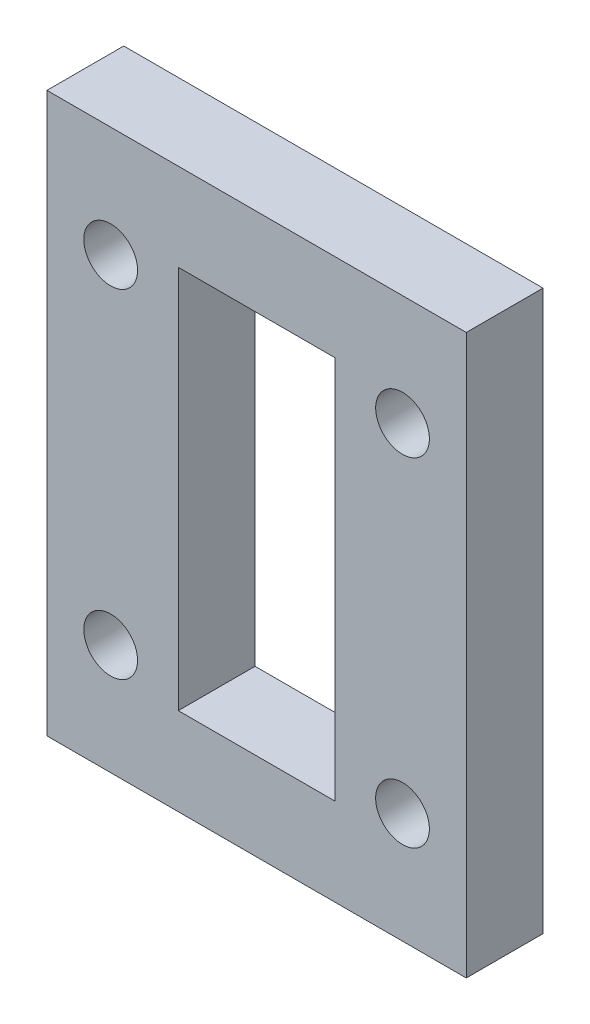
ISO-10303-21;
HEADER;
FILE_DESCRIPTION(('STEP AP214'),'2;1');
FILE_NAME('part.step','',(''),(''),'','','');
FILE_SCHEMA(('AUTOMOTIVE_DESIGN { 1 0 10303 214 1 1 1 1 }'));
ENDSEC;
DATA;
#1=APPLICATION_CONTEXT('core data for automotive mechanical design processes');
#2=APPLICATION_PROTOCOL_DEFINITION('international standard','automotive_design',2000,#1);
#3=PRODUCT_CONTEXT('',#1,'mechanical');
#4=PRODUCT('Part','Part','',(#3));
#5=PRODUCT_RELATED_PRODUCT_CATEGORY('part','',(#4));
#6=PRODUCT_DEFINITION_FORMATION('','',#4);
#7=PRODUCT_DEFINITION_CONTEXT('part definition',#1,'design');
#8=PRODUCT_DEFINITION('design','',#6,#7);
#9=PRODUCT_DEFINITION_SHAPE('','',#8);
#10=(LENGTH_UNIT() NAMED_UNIT(*) SI_UNIT(.MILLI.,.METRE.));
#11=(NAMED_UNIT(*) PLANE_ANGLE_UNIT() SI_UNIT($,.RADIAN.));
#12=(NAMED_UNIT(*) SI_UNIT($,.STERADIAN.) SOLID_ANGLE_UNIT());
#13=UNCERTAINTY_MEASURE_WITH_UNIT(LENGTH_MEASURE(1.E-05),#10,'distance_accuracy_value','');
#14=(GEOMETRIC_REPRESENTATION_CONTEXT(3) GLOBAL_UNCERTAINTY_ASSIGNED_CONTEXT((#13)) GLOBAL_UNIT_ASSIGNED_CONTEXT((#10,
#11,#12)) REPRESENTATION_CONTEXT('',''));
#15=CARTESIAN_POINT('',(0.,0.,0.));
#16=DIRECTION('',(0.,0.,1.));
#17=DIRECTION('',(1.,0.,0.));
#18=AXIS2_PLACEMENT_3D('',#15,#16,#17);
#19=CARTESIAN_POINT('',(0.,0.,5.));
#20=DIRECTION('',(0.,0.,-1.));
#21=DIRECTION('',(-1.,0.,0.));
#22=AXIS2_PLACEMENT_3D('',#19,#20,#21);
#23=PLANE('',#22);
#24=CARTESIAN_POINT('',(9.5,11.,5.));
#25=DIRECTION('',(0.,0.,1.));
#26=DIRECTION('',(-1.,0.,0.));
#27=AXIS2_PLACEMENT_3D('',#24,#25,#26);
#28=CIRCLE('',#27,1.75);
#29=CARTESIAN_POINT('',(7.75,11.,5.));
#30=VERTEX_POINT('',#29);
#31=EDGE_CURVE('E250',#30,#30,#28,.T.);
#32=ORIENTED_EDGE('',*,*,#31,.F.);
#33=EDGE_LOOP('',(#32));
#34=FACE_BOUND('',#33,.T.);
#35=CARTESIAN_POINT('',(-9.5,-11.,5.));
#36=DIRECTION('',(0.,0.,1.));
#37=DIRECTION('',(-1.,0.,0.));
#38=AXIS2_PLACEMENT_3D('',#35,#36,#37);
#39=CIRCLE('',#38,1.75);
#40=CARTESIAN_POINT('',(-11.25,-11.,5.));
#41=VERTEX_POINT('',#40);
#42=EDGE_CURVE('E243',#41,#41,#39,.T.);
#43=ORIENTED_EDGE('',*,*,#42,.F.);
#44=EDGE_LOOP('',(#43));
#45=FACE_BOUND('',#44,.T.);
#46=CARTESIAN_POINT('',(9.5,-11.,5.));
#47=DIRECTION('',(0.,0.,1.));
#48=DIRECTION('',(1.,0.,0.));
#49=AXIS2_PLACEMENT_3D('',#46,#47,#48);
#50=CIRCLE('',#49,1.75);
#51=CARTESIAN_POINT('',(11.25,-11.,5.));
#52=VERTEX_POINT('',#51);
#53=EDGE_CURVE('E238',#52,#52,#50,.T.);
#54=ORIENTED_EDGE('',*,*,#53,.F.);
#55=EDGE_LOOP('',(#54));
#56=FACE_BOUND('',#55,.T.);
#57=CARTESIAN_POINT('',(-9.5,11.,5.));
#58=DIRECTION('',(0.,0.,1.));
#59=DIRECTION('',(1.,0.,0.));
#60=AXIS2_PLACEMENT_3D('',#57,#58,#59);
#61=CIRCLE('',#60,1.75);
#62=CARTESIAN_POINT('',(-7.75,11.,5.));
#63=VERTEX_POINT('',#62);
#64=EDGE_CURVE('E255',#63,#63,#61,.T.);
#65=ORIENTED_EDGE('',*,*,#64,.F.);
#66=EDGE_LOOP('',(#65));
#67=FACE_BOUND('',#66,.T.);
#68=DIRECTION('',(0.,1.,0.));
#69=VECTOR('',#68,1.);
#70=CARTESIAN_POINT('',(13.65,-18.2,5.));
#71=LINE('',#70,#69);
#72=CARTESIAN_POINT('',(13.65,-18.2,5.));
#73=VERTEX_POINT('',#72);
#74=CARTESIAN_POINT('',(13.65,18.2,5.));
#75=VERTEX_POINT('',#74);
#76=EDGE_CURVE('E138',#73,#75,#71,.T.);
#77=ORIENTED_EDGE('',*,*,#76,.T.);
#78=DIRECTION('',(-1.,0.,0.));
#79=VECTOR('',#78,1.);
#80=CARTESIAN_POINT('',(-13.65,18.2,5.));
#81=LINE('',#80,#79);
#82=CARTESIAN_POINT('',(-13.65,18.2,5.));
#83=VERTEX_POINT('',#82);
#84=EDGE_CURVE('E141',#75,#83,#81,.T.);
#85=ORIENTED_EDGE('',*,*,#84,.T.);
#86=DIRECTION('',(0.,-1.,0.));
#87=VECTOR('',#86,1.);
#88=CARTESIAN_POINT('',(-13.65,-18.2,5.));
#89=LINE('',#88,#87);
#90=CARTESIAN_POINT('',(-13.65,-18.2,5.));
#91=VERTEX_POINT('',#90);
#92=EDGE_CURVE('E144',#83,#91,#89,.T.);
#93=ORIENTED_EDGE('',*,*,#92,.T.);
#94=DIRECTION('',(1.,0.,0.));
#95=VECTOR('',#94,1.);
#96=CARTESIAN_POINT('',(-13.65,-18.2,5.));
#97=LINE('',#96,#95);
#98=EDGE_CURVE('E146',#91,#73,#97,.T.);
#99=ORIENTED_EDGE('',*,*,#98,.T.);
#100=EDGE_LOOP('',(#77,#85,#93,#99));
#101=FACE_BOUND('',#100,.T.);
#102=DIRECTION('',(0.,1.,0.));
#103=VECTOR('',#102,1.);
#104=CARTESIAN_POINT('',(5.09999999999999,-12.5,5.));
#105=LINE('',#104,#103);
#106=CARTESIAN_POINT('',(5.09999999999999,-12.5,5.));
#107=VERTEX_POINT('',#106);
#108=CARTESIAN_POINT('',(5.09999999999999,12.5,5.));
#109=VERTEX_POINT('',#108);
#110=EDGE_CURVE('E100',#107,#109,#105,.T.);
#111=ORIENTED_EDGE('',*,*,#110,.F.);
#112=DIRECTION('',(1.,0.,0.));
#113=VECTOR('',#112,1.);
#114=CARTESIAN_POINT('',(-5.10000000000001,-12.5,5.));
#115=LINE('',#114,#113);
#116=CARTESIAN_POINT('',(-5.10000000000001,-12.5,5.));
#117=VERTEX_POINT('',#116);
#118=EDGE_CURVE('E122',#117,#107,#115,.T.);
#119=ORIENTED_EDGE('',*,*,#118,.F.);
#120=DIRECTION('',(0.,-1.,0.));
#121=VECTOR('',#120,1.);
#122=CARTESIAN_POINT('',(-5.10000000000001,-12.5,5.));
#123=LINE('',#122,#121);
#124=CARTESIAN_POINT('',(-5.10000000000001,12.5,5.));
#125=VERTEX_POINT('',#124);
#126=EDGE_CURVE('E120',#125,#117,#123,.T.);
#127=ORIENTED_EDGE('',*,*,#126,.F.);
#128=DIRECTION('',(-1.,0.,0.));
#129=VECTOR('',#128,1.);
#130=CARTESIAN_POINT('',(-5.10000000000001,12.5,5.));
#131=LINE('',#130,#129);
#132=EDGE_CURVE('E108',#109,#125,#131,.T.);
#133=ORIENTED_EDGE('',*,*,#132,.F.);
#134=EDGE_LOOP('',(#111,#119,#127,#133));
#135=FACE_BOUND('',#134,.T.);
#136=ADVANCED_FACE('F35',(#34,#45,#56,#67,#101,#135),#23,.F.);
#137=CARTESIAN_POINT('',(0.,0.,0.));
#138=DIRECTION('',(0.,0.,-1.));
#139=DIRECTION('',(-1.,0.,0.));
#140=AXIS2_PLACEMENT_3D('',#137,#138,#139);
#141=PLANE('',#140);
#142=CARTESIAN_POINT('',(9.5,11.,0.));
#143=DIRECTION('',(0.,0.,-1.));
#144=DIRECTION('',(-1.,0.,0.));
#145=AXIS2_PLACEMENT_3D('',#142,#143,#144);
#146=CIRCLE('',#145,1.75);
#147=CARTESIAN_POINT('',(7.75,11.,0.));
#148=VERTEX_POINT('',#147);
#149=EDGE_CURVE('E253',#148,#148,#146,.F.);
#150=ORIENTED_EDGE('',*,*,#149,.T.);
#151=EDGE_LOOP('',(#150));
#152=FACE_BOUND('',#151,.T.);
#153=CARTESIAN_POINT('',(-9.5,-11.,0.));
#154=DIRECTION('',(0.,0.,-1.));
#155=DIRECTION('',(-1.,0.,0.));
#156=AXIS2_PLACEMENT_3D('',#153,#154,#155);
#157=CIRCLE('',#156,1.75);
#158=CARTESIAN_POINT('',(-11.25,-11.,0.));
#159=VERTEX_POINT('',#158);
#160=EDGE_CURVE('E246',#159,#159,#157,.F.);
#161=ORIENTED_EDGE('',*,*,#160,.T.);
#162=EDGE_LOOP('',(#161));
#163=FACE_BOUND('',#162,.T.);
#164=CARTESIAN_POINT('',(9.5,-11.,0.));
#165=DIRECTION('',(0.,0.,-1.));
#166=DIRECTION('',(-1.,0.,0.));
#167=AXIS2_PLACEMENT_3D('',#164,#165,#166);
#168=CIRCLE('',#167,1.75);
#169=CARTESIAN_POINT('',(7.75,-11.,0.));
#170=VERTEX_POINT('',#169);
#171=EDGE_CURVE('E241',#170,#170,#168,.F.);
#172=ORIENTED_EDGE('',*,*,#171,.T.);
#173=EDGE_LOOP('',(#172));
#174=FACE_BOUND('',#173,.T.);
#175=CARTESIAN_POINT('',(-9.5,11.,0.));
#176=DIRECTION('',(0.,0.,-1.));
#177=DIRECTION('',(-1.,0.,0.));
#178=AXIS2_PLACEMENT_3D('',#175,#176,#177);
#179=CIRCLE('',#178,1.75);
#180=CARTESIAN_POINT('',(-11.25,11.,0.));
#181=VERTEX_POINT('',#180);
#182=EDGE_CURVE('E128',#181,#181,#179,.F.);
#183=ORIENTED_EDGE('',*,*,#182,.T.);
#184=EDGE_LOOP('',(#183));
#185=FACE_BOUND('',#184,.T.);
#186=DIRECTION('',(0.,1.,0.));
#187=VECTOR('',#186,1.);
#188=CARTESIAN_POINT('',(13.65,-18.2,0.));
#189=LINE('',#188,#187);
#190=CARTESIAN_POINT('',(13.65,-18.2,0.));
#191=VERTEX_POINT('',#190);
#192=CARTESIAN_POINT('',(13.65,18.2,0.));
#193=VERTEX_POINT('',#192);
#194=EDGE_CURVE('E116',#191,#193,#189,.T.);
#195=ORIENTED_EDGE('',*,*,#194,.F.);
#196=DIRECTION('',(1.,0.,0.));
#197=VECTOR('',#196,1.);
#198=CARTESIAN_POINT('',(-13.65,-18.2,0.));
#199=LINE('',#198,#197);
#200=CARTESIAN_POINT('',(-13.65,-18.2,0.));
#201=VERTEX_POINT('',#200);
#202=EDGE_CURVE('E142',#201,#191,#199,.T.);
#203=ORIENTED_EDGE('',*,*,#202,.F.);
#204=DIRECTION('',(0.,-1.,0.));
#205=VECTOR('',#204,1.);
#206=CARTESIAN_POINT('',(-13.65,-18.2,0.));
#207=LINE('',#206,#205);
#208=CARTESIAN_POINT('',(-13.65,18.2,0.));
#209=VERTEX_POINT('',#208);
#210=EDGE_CURVE('E153',#209,#201,#207,.T.);
#211=ORIENTED_EDGE('',*,*,#210,.F.);
#212=DIRECTION('',(-1.,0.,0.));
#213=VECTOR('',#212,1.);
#214=CARTESIAN_POINT('',(-13.65,18.2,0.));
#215=LINE('',#214,#213);
#216=EDGE_CURVE('E151',#193,#209,#215,.T.);
#217=ORIENTED_EDGE('',*,*,#216,.F.);
#218=EDGE_LOOP('',(#195,#203,#211,#217));
#219=FACE_BOUND('',#218,.T.);
#220=DIRECTION('',(1.,0.,0.));
#221=VECTOR('',#220,1.);
#222=CARTESIAN_POINT('',(-5.10000000000001,-12.5,0.));
#223=LINE('',#222,#221);
#224=CARTESIAN_POINT('',(-5.10000000000001,-12.5,0.));
#225=VERTEX_POINT('',#224);
#226=CARTESIAN_POINT('',(5.09999999999999,-12.5,0.));
#227=VERTEX_POINT('',#226);
#228=EDGE_CURVE('E109',#225,#227,#223,.T.);
#229=ORIENTED_EDGE('',*,*,#228,.T.);
#230=DIRECTION('',(0.,1.,0.));
#231=VECTOR('',#230,1.);
#232=CARTESIAN_POINT('',(5.09999999999999,-12.5,0.));
#233=LINE('',#232,#231);
#234=CARTESIAN_POINT('',(5.09999999999999,12.5,0.));
#235=VERTEX_POINT('',#234);
#236=EDGE_CURVE('E58',#227,#235,#233,.T.);
#237=ORIENTED_EDGE('',*,*,#236,.T.);
#238=DIRECTION('',(-1.,0.,0.));
#239=VECTOR('',#238,1.);
#240=CARTESIAN_POINT('',(-5.10000000000001,12.5,0.));
#241=LINE('',#240,#239);
#242=CARTESIAN_POINT('',(-5.10000000000001,12.5,0.));
#243=VERTEX_POINT('',#242);
#244=EDGE_CURVE('E115',#235,#243,#241,.T.);
#245=ORIENTED_EDGE('',*,*,#244,.T.);
#246=DIRECTION('',(0.,-1.,0.));
#247=VECTOR('',#246,1.);
#248=CARTESIAN_POINT('',(-5.10000000000001,-12.5,0.));
#249=LINE('',#248,#247);
#250=EDGE_CURVE('E130',#243,#225,#249,.T.);
#251=ORIENTED_EDGE('',*,*,#250,.T.);
#252=EDGE_LOOP('',(#229,#237,#245,#251));
#253=FACE_BOUND('',#252,.T.);
#254=ADVANCED_FACE('F171',(#152,#163,#174,#185,#219,#253),#141,.T.);
#255=CARTESIAN_POINT('',(13.65,-18.2,5.));
#256=DIRECTION('',(-1.,0.,0.));
#257=DIRECTION('',(0.,0.,1.));
#258=AXIS2_PLACEMENT_3D('',#255,#256,#257);
#259=PLANE('',#258);
#260=ORIENTED_EDGE('',*,*,#194,.T.);
#261=DIRECTION('',(0.,0.,-1.));
#262=VECTOR('',#261,1.);
#263=CARTESIAN_POINT('',(13.65,18.2,5.));
#264=LINE('',#263,#262);
#265=EDGE_CURVE('E11',#75,#193,#264,.T.);
#266=ORIENTED_EDGE('',*,*,#265,.F.);
#267=ORIENTED_EDGE('',*,*,#76,.F.);
#268=DIRECTION('',(0.,0.,-1.));
#269=VECTOR('',#268,1.);
#270=CARTESIAN_POINT('',(13.65,-18.2,5.));
#271=LINE('',#270,#269);
#272=EDGE_CURVE('E148',#73,#191,#271,.T.);
#273=ORIENTED_EDGE('',*,*,#272,.T.);
#274=EDGE_LOOP('',(#260,#266,#267,#273));
#275=FACE_BOUND('',#274,.T.);
#276=ADVANCED_FACE('F37',(#275),#259,.F.);
#277=CARTESIAN_POINT('',(-13.65,18.2,5.));
#278=DIRECTION('',(0.,-1.,0.));
#279=DIRECTION('',(0.,0.,-1.));
#280=AXIS2_PLACEMENT_3D('',#277,#278,#279);
#281=PLANE('',#280);
#282=ORIENTED_EDGE('',*,*,#216,.T.);
#283=DIRECTION('',(0.,0.,-1.));
#284=VECTOR('',#283,1.);
#285=CARTESIAN_POINT('',(-13.65,18.2,5.));
#286=LINE('',#285,#284);
#287=EDGE_CURVE('E43',#83,#209,#286,.T.);
#288=ORIENTED_EDGE('',*,*,#287,.F.);
#289=ORIENTED_EDGE('',*,*,#84,.F.);
#290=ORIENTED_EDGE('',*,*,#265,.T.);
#291=EDGE_LOOP('',(#282,#288,#289,#290));
#292=FACE_BOUND('',#291,.T.);
#293=ADVANCED_FACE('F181',(#292),#281,.F.);
#294=CARTESIAN_POINT('',(-13.65,-18.2,5.));
#295=DIRECTION('',(1.,0.,0.));
#296=DIRECTION('',(0.,0.,-1.));
#297=AXIS2_PLACEMENT_3D('',#294,#295,#296);
#298=PLANE('',#297);
#299=ORIENTED_EDGE('',*,*,#210,.T.);
#300=DIRECTION('',(0.,0.,-1.));
#301=VECTOR('',#300,1.);
#302=CARTESIAN_POINT('',(-13.65,-18.2,5.));
#303=LINE('',#302,#301);
#304=EDGE_CURVE('E158',#91,#201,#303,.T.);
#305=ORIENTED_EDGE('',*,*,#304,.F.);
#306=ORIENTED_EDGE('',*,*,#92,.F.);
#307=ORIENTED_EDGE('',*,*,#287,.T.);
#308=EDGE_LOOP('',(#299,#305,#306,#307));
#309=FACE_BOUND('',#308,.T.);
#310=ADVANCED_FACE('F165',(#309),#298,.F.);
#311=CARTESIAN_POINT('',(-13.65,-18.2,5.));
#312=DIRECTION('',(0.,1.,0.));
#313=DIRECTION('',(0.,0.,1.));
#314=AXIS2_PLACEMENT_3D('',#311,#312,#313);
#315=PLANE('',#314);
#316=ORIENTED_EDGE('',*,*,#202,.T.);
#317=ORIENTED_EDGE('',*,*,#272,.F.);
#318=ORIENTED_EDGE('',*,*,#98,.F.);
#319=ORIENTED_EDGE('',*,*,#304,.T.);
#320=EDGE_LOOP('',(#316,#317,#318,#319));
#321=FACE_BOUND('',#320,.T.);
#322=ADVANCED_FACE('F175',(#321),#315,.F.);
#323=CARTESIAN_POINT('',(5.09999999999999,-12.5,5.));
#324=DIRECTION('',(-1.,0.,0.));
#325=DIRECTION('',(0.,0.,1.));
#326=AXIS2_PLACEMENT_3D('',#323,#324,#325);
#327=PLANE('',#326);
#328=ORIENTED_EDGE('',*,*,#236,.F.);
#329=DIRECTION('',(0.,0.,-1.));
#330=VECTOR('',#329,1.);
#331=CARTESIAN_POINT('',(5.09999999999999,-12.5,5.));
#332=LINE('',#331,#330);
#333=EDGE_CURVE('E104',#107,#227,#332,.T.);
#334=ORIENTED_EDGE('',*,*,#333,.F.);
#335=ORIENTED_EDGE('',*,*,#110,.T.);
#336=DIRECTION('',(0.,0.,-1.));
#337=VECTOR('',#336,1.);
#338=CARTESIAN_POINT('',(5.09999999999999,12.5,5.));
#339=LINE('',#338,#337);
#340=EDGE_CURVE('E103',#109,#235,#339,.T.);
#341=ORIENTED_EDGE('',*,*,#340,.T.);
#342=EDGE_LOOP('',(#328,#334,#335,#341));
#343=FACE_BOUND('',#342,.T.);
#344=ADVANCED_FACE('F102',(#343),#327,.T.);
#345=CARTESIAN_POINT('',(-5.10000000000001,12.5,5.));
#346=DIRECTION('',(0.,-1.,0.));
#347=DIRECTION('',(0.,0.,-1.));
#348=AXIS2_PLACEMENT_3D('',#345,#346,#347);
#349=PLANE('',#348);
#350=ORIENTED_EDGE('',*,*,#244,.F.);
#351=ORIENTED_EDGE('',*,*,#340,.F.);
#352=ORIENTED_EDGE('',*,*,#132,.T.);
#353=DIRECTION('',(0.,0.,-1.));
#354=VECTOR('',#353,1.);
#355=CARTESIAN_POINT('',(-5.10000000000001,12.5,5.));
#356=LINE('',#355,#354);
#357=EDGE_CURVE('E117',#125,#243,#356,.T.);
#358=ORIENTED_EDGE('',*,*,#357,.T.);
#359=EDGE_LOOP('',(#350,#351,#352,#358));
#360=FACE_BOUND('',#359,.T.);
#361=ADVANCED_FACE('F112',(#360),#349,.T.);
#362=CARTESIAN_POINT('',(-5.10000000000001,-12.5,5.));
#363=DIRECTION('',(1.,0.,0.));
#364=DIRECTION('',(0.,0.,-1.));
#365=AXIS2_PLACEMENT_3D('',#362,#363,#364);
#366=PLANE('',#365);
#367=ORIENTED_EDGE('',*,*,#250,.F.);
#368=ORIENTED_EDGE('',*,*,#357,.F.);
#369=ORIENTED_EDGE('',*,*,#126,.T.);
#370=DIRECTION('',(0.,0.,-1.));
#371=VECTOR('',#370,1.);
#372=CARTESIAN_POINT('',(-5.10000000000001,-12.5,5.));
#373=LINE('',#372,#371);
#374=EDGE_CURVE('E50',#117,#225,#373,.T.);
#375=ORIENTED_EDGE('',*,*,#374,.T.);
#376=EDGE_LOOP('',(#367,#368,#369,#375));
#377=FACE_BOUND('',#376,.T.);
#378=ADVANCED_FACE('F208',(#377),#366,.T.);
#379=CARTESIAN_POINT('',(-5.10000000000001,-12.5,5.));
#380=DIRECTION('',(0.,1.,0.));
#381=DIRECTION('',(0.,0.,1.));
#382=AXIS2_PLACEMENT_3D('',#379,#380,#381);
#383=PLANE('',#382);
#384=ORIENTED_EDGE('',*,*,#228,.F.);
#385=ORIENTED_EDGE('',*,*,#374,.F.);
#386=ORIENTED_EDGE('',*,*,#118,.T.);
#387=ORIENTED_EDGE('',*,*,#333,.T.);
#388=EDGE_LOOP('',(#384,#385,#386,#387));
#389=FACE_BOUND('',#388,.T.);
#390=ADVANCED_FACE('F212',(#389),#383,.T.);
#391=CARTESIAN_POINT('',(-9.5,11.,-4.94974746830583));
#392=DIRECTION('',(0.,0.,1.));
#393=DIRECTION('',(1.,0.,0.));
#394=AXIS2_PLACEMENT_3D('',#391,#392,#393);
#395=CYLINDRICAL_SURFACE('',#394,1.75);
#396=ORIENTED_EDGE('',*,*,#64,.T.);
#397=EDGE_LOOP('',(#396));
#398=FACE_BOUND('',#397,.T.);
#399=ORIENTED_EDGE('',*,*,#182,.F.);
#400=EDGE_LOOP('',(#399));
#401=FACE_BOUND('',#400,.T.);
#402=ADVANCED_FACE('F218',(#398,#401),#395,.F.);
#403=CARTESIAN_POINT('',(9.5,-11.,-4.94974746830583));
#404=DIRECTION('',(0.,0.,1.));
#405=DIRECTION('',(1.,0.,0.));
#406=AXIS2_PLACEMENT_3D('',#403,#404,#405);
#407=CYLINDRICAL_SURFACE('',#406,1.75);
#408=ORIENTED_EDGE('',*,*,#53,.T.);
#409=EDGE_LOOP('',(#408));
#410=FACE_BOUND('',#409,.T.);
#411=ORIENTED_EDGE('',*,*,#171,.F.);
#412=EDGE_LOOP('',(#411));
#413=FACE_BOUND('',#412,.T.);
#414=ADVANCED_FACE('F221',(#410,#413),#407,.F.);
#415=CARTESIAN_POINT('',(-9.5,-11.,-4.94974746830583));
#416=DIRECTION('',(0.,0.,1.));
#417=DIRECTION('',(1.,0.,0.));
#418=AXIS2_PLACEMENT_3D('',#415,#416,#417);
#419=CYLINDRICAL_SURFACE('',#418,1.75);
#420=ORIENTED_EDGE('',*,*,#42,.T.);
#421=EDGE_LOOP('',(#420));
#422=FACE_BOUND('',#421,.T.);
#423=ORIENTED_EDGE('',*,*,#160,.F.);
#424=EDGE_LOOP('',(#423));
#425=FACE_BOUND('',#424,.T.);
#426=ADVANCED_FACE('F223',(#422,#425),#419,.F.);
#427=CARTESIAN_POINT('',(9.5,11.,-4.94974746830583));
#428=DIRECTION('',(0.,0.,1.));
#429=DIRECTION('',(1.,0.,0.));
#430=AXIS2_PLACEMENT_3D('',#427,#428,#429);
#431=CYLINDRICAL_SURFACE('',#430,1.75);
#432=ORIENTED_EDGE('',*,*,#31,.T.);
#433=EDGE_LOOP('',(#432));
#434=FACE_BOUND('',#433,.T.);
#435=ORIENTED_EDGE('',*,*,#149,.F.);
#436=EDGE_LOOP('',(#435));
#437=FACE_BOUND('',#436,.T.);
#438=ADVANCED_FACE('F226',(#434,#437),#431,.F.);
#439=CLOSED_SHELL('',(#136,#254,#276,#293,#310,#322,#344,#361,#378,#390,#402,#414,#426,#438));
#440=MANIFOLD_SOLID_BREP('B2',#439);
#441=ADVANCED_BREP_SHAPE_REPRESENTATION('',(#18,#440),#14);
#442=SHAPE_DEFINITION_REPRESENTATION(#9,#441);
ENDSEC;
END-ISO-10303-21;
